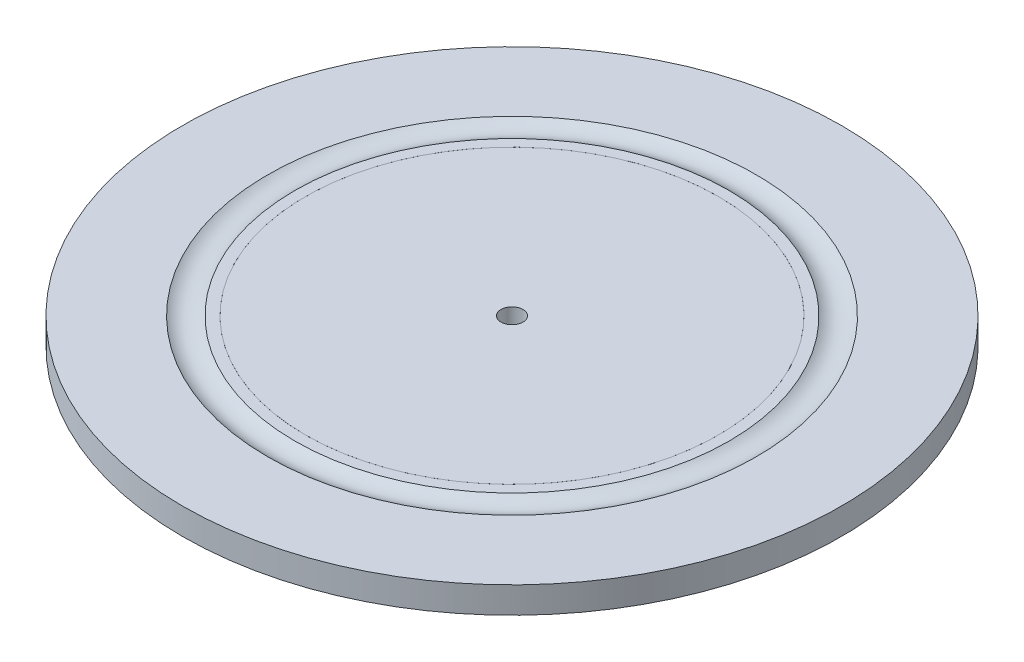
ISO-10303-21;
HEADER;
FILE_DESCRIPTION(('STEP AP214'),'2;1');
FILE_NAME('part.step','',(''),(''),'','','');
FILE_SCHEMA(('AUTOMOTIVE_DESIGN { 1 0 10303 214 1 1 1 1 }'));
ENDSEC;
DATA;
#1=APPLICATION_CONTEXT('core data for automotive mechanical design processes');
#2=APPLICATION_PROTOCOL_DEFINITION('international standard','automotive_design',2000,#1);
#3=PRODUCT_CONTEXT('',#1,'mechanical');
#4=PRODUCT('Part','Part','',(#3));
#5=PRODUCT_RELATED_PRODUCT_CATEGORY('part','',(#4));
#6=PRODUCT_DEFINITION_FORMATION('','',#4);
#7=PRODUCT_DEFINITION_CONTEXT('part definition',#1,'design');
#8=PRODUCT_DEFINITION('design','',#6,#7);
#9=PRODUCT_DEFINITION_SHAPE('','',#8);
#10=(LENGTH_UNIT() NAMED_UNIT(*) SI_UNIT(.MILLI.,.METRE.));
#11=(NAMED_UNIT(*) PLANE_ANGLE_UNIT() SI_UNIT($,.RADIAN.));
#12=(NAMED_UNIT(*) SI_UNIT($,.STERADIAN.) SOLID_ANGLE_UNIT());
#13=UNCERTAINTY_MEASURE_WITH_UNIT(LENGTH_MEASURE(1.E-05),#10,'distance_accuracy_value','');
#14=(GEOMETRIC_REPRESENTATION_CONTEXT(3) GLOBAL_UNCERTAINTY_ASSIGNED_CONTEXT((#13)) GLOBAL_UNIT_ASSIGNED_CONTEXT((#10,
#11,#12)) REPRESENTATION_CONTEXT('',''));
#15=CARTESIAN_POINT('',(0.,0.,0.));
#16=DIRECTION('',(0.,0.,1.));
#17=DIRECTION('',(1.,0.,0.));
#18=AXIS2_PLACEMENT_3D('',#15,#16,#17);
#19=CARTESIAN_POINT('',(59.,0.8724,0.));
#20=DIRECTION('',(0.,-1.,0.));
#21=DIRECTION('',(0.,0.,-1.));
#22=AXIS2_PLACEMENT_3D('',#19,#20,#21);
#23=PLANE('',#22);
#24=CARTESIAN_POINT('',(0.,0.8724,0.));
#25=DIRECTION('',(0.,1.,0.));
#26=DIRECTION('',(0.,0.,1.));
#27=AXIS2_PLACEMENT_3D('',#24,#25,#26);
#28=CIRCLE('',#27,47.);
#29=CARTESIAN_POINT('',(0.,0.8724,47.));
#30=VERTEX_POINT('',#29);
#31=EDGE_CURVE('E50',#30,#30,#28,.T.);
#32=ORIENTED_EDGE('',*,*,#31,.T.);
#33=EDGE_LOOP('',(#32));
#34=FACE_BOUND('',#33,.T.);
#35=CARTESIAN_POINT('',(0.,0.8724,0.));
#36=DIRECTION('',(0.,-1.,0.));
#37=DIRECTION('',(0.,0.,-1.));
#38=AXIS2_PLACEMENT_3D('',#35,#36,#37);
#39=CIRCLE('',#38,75.);
#40=CARTESIAN_POINT('',(0.,0.8724,-75.));
#41=VERTEX_POINT('',#40);
#42=EDGE_CURVE('E59',#41,#41,#39,.T.);
#43=ORIENTED_EDGE('',*,*,#42,.T.);
#44=EDGE_LOOP('',(#43));
#45=FACE_BOUND('',#44,.T.);
#46=ADVANCED_FACE('F39',(#34,#45),#23,.T.);
#47=CARTESIAN_POINT('',(0.,1.8724,0.));
#48=DIRECTION('',(0.,1.,0.));
#49=DIRECTION('',(0.,0.,1.));
#50=AXIS2_PLACEMENT_3D('',#47,#48,#49);
#51=TOROIDAL_SURFACE('',#50,47.,1.);
#52=CARTESIAN_POINT('',(0.,0.872424878980681,0.));
#53=DIRECTION('',(0.,1.,0.));
#54=DIRECTION('',(0.,0.,1.));
#55=AXIS2_PLACEMENT_3D('',#52,#53,#54);
#56=CIRCLE('',#55,46.9929461115406);
#57=CARTESIAN_POINT('',(0.,0.872424878980681,46.9929461115406));
#58=VERTEX_POINT('',#57);
#59=EDGE_CURVE('E11',#58,#58,#56,.F.);
#60=ORIENTED_EDGE('',*,*,#59,.F.);
#61=EDGE_LOOP('',(#60));
#62=FACE_BOUND('',#61,.T.);
#63=ORIENTED_EDGE('',*,*,#31,.F.);
#64=EDGE_LOOP('',(#63));
#65=FACE_BOUND('',#64,.T.);
#66=ADVANCED_FACE('F75',(#62,#65),#51,.T.);
#67=CARTESIAN_POINT('',(0.,5.8724,0.));
#68=DIRECTION('',(0.,1.,0.));
#69=DIRECTION('',(0.,0.,1.));
#70=AXIS2_PLACEMENT_3D('',#67,#68,#69);
#71=CONICAL_SURFACE('',#70,46.,0.785398163397353);
#72=CARTESIAN_POINT('',(0.,6.86534611154079,0.));
#73=DIRECTION('',(0.,1.,0.));
#74=DIRECTION('',(0.,0.,1.));
#75=AXIS2_PLACEMENT_3D('',#72,#73,#74);
#76=CIRCLE('',#75,46.9929461115406);
#77=CARTESIAN_POINT('',(0.,6.86534611154079,46.9929461115406));
#78=VERTEX_POINT('',#77);
#79=EDGE_CURVE('E42',#78,#78,#76,.T.);
#80=ORIENTED_EDGE('',*,*,#79,.F.);
#81=EDGE_LOOP('',(#80));
#82=FACE_BOUND('',#81,.T.);
#83=CARTESIAN_POINT('',(0.,6.87240000000019,0.));
#84=DIRECTION('',(0.,1.,0.));
#85=DIRECTION('',(0.,0.,1.));
#86=AXIS2_PLACEMENT_3D('',#83,#84,#85);
#87=CIRCLE('',#86,47.);
#88=CARTESIAN_POINT('',(0.,6.87240000000019,47.));
#89=VERTEX_POINT('',#88);
#90=EDGE_CURVE('E68',#89,#89,#87,.T.);
#91=ORIENTED_EDGE('',*,*,#90,.T.);
#92=EDGE_LOOP('',(#91));
#93=FACE_BOUND('',#92,.T.);
#94=ADVANCED_FACE('F77',(#82,#93),#71,.F.);
#95=CARTESIAN_POINT('',(47.,6.87240000000009,0.));
#96=DIRECTION('',(0.,1.,0.));
#97=DIRECTION('',(0.,0.,1.));
#98=AXIS2_PLACEMENT_3D('',#95,#96,#97);
#99=PLANE('',#98);
#100=CARTESIAN_POINT('',(0.,6.8724,0.));
#101=DIRECTION('',(0.,1.,0.));
#102=DIRECTION('',(0.,0.,1.));
#103=AXIS2_PLACEMENT_3D('',#100,#101,#102);
#104=CIRCLE('',#103,49.4043);
#105=CARTESIAN_POINT('',(0.,6.8724,49.4043));
#106=VERTEX_POINT('',#105);
#107=EDGE_CURVE('E65',#106,#106,#104,.T.);
#108=ORIENTED_EDGE('',*,*,#107,.T.);
#109=EDGE_LOOP('',(#108));
#110=FACE_BOUND('',#109,.T.);
#111=ORIENTED_EDGE('',*,*,#90,.F.);
#112=EDGE_LOOP('',(#111));
#113=FACE_BOUND('',#112,.T.);
#114=ADVANCED_FACE('F83',(#110,#113),#99,.T.);
#115=CARTESIAN_POINT('',(0.,11.,0.));
#116=DIRECTION('',(0.,1.,0.));
#117=DIRECTION('',(0.,0.,1.));
#118=AXIS2_PLACEMENT_3D('',#115,#116,#117);
#119=TOROIDAL_SURFACE('',#118,52.5,5.15950000000006);
#120=CARTESIAN_POINT('',(0.,6.87239999999989,0.));
#121=DIRECTION('',(0.,1.,0.));
#122=DIRECTION('',(0.,0.,1.));
#123=AXIS2_PLACEMENT_3D('',#120,#121,#122);
#124=CIRCLE('',#123,55.5957);
#125=CARTESIAN_POINT('',(0.,6.87239999999989,55.5957));
#126=VERTEX_POINT('',#125);
#127=EDGE_CURVE('E58',#126,#126,#124,.T.);
#128=ORIENTED_EDGE('',*,*,#127,.T.);
#129=EDGE_LOOP('',(#128));
#130=FACE_BOUND('',#129,.T.);
#131=ORIENTED_EDGE('',*,*,#107,.F.);
#132=EDGE_LOOP('',(#131));
#133=FACE_BOUND('',#132,.T.);
#134=ADVANCED_FACE('F89',(#130,#133),#119,.F.);
#135=CARTESIAN_POINT('',(55.5957,6.87239999999995,0.));
#136=DIRECTION('',(0.,1.,0.));
#137=DIRECTION('',(0.,0.,1.));
#138=AXIS2_PLACEMENT_3D('',#135,#136,#137);
#139=PLANE('',#138);
#140=ORIENTED_EDGE('',*,*,#127,.F.);
#141=EDGE_LOOP('',(#140));
#142=FACE_BOUND('',#141,.T.);
#143=CARTESIAN_POINT('',(0.,6.8724,0.));
#144=DIRECTION('',(0.,-1.,0.));
#145=DIRECTION('',(0.,0.,-1.));
#146=AXIS2_PLACEMENT_3D('',#143,#144,#145);
#147=CIRCLE('',#146,75.);
#148=CARTESIAN_POINT('',(0.,6.8724,-75.));
#149=VERTEX_POINT('',#148);
#150=EDGE_CURVE('E55',#149,#149,#147,.T.);
#151=ORIENTED_EDGE('',*,*,#150,.F.);
#152=EDGE_LOOP('',(#151));
#153=FACE_BOUND('',#152,.T.);
#154=ADVANCED_FACE('F93',(#142,#153),#139,.T.);
#155=CARTESIAN_POINT('',(0.,6.8724,0.));
#156=DIRECTION('',(0.,-1.,0.));
#157=DIRECTION('',(0.,0.,-1.));
#158=AXIS2_PLACEMENT_3D('',#155,#156,#157);
#159=CYLINDRICAL_SURFACE('',#158,75.);
#160=ORIENTED_EDGE('',*,*,#150,.T.);
#161=EDGE_LOOP('',(#160));
#162=FACE_BOUND('',#161,.T.);
#163=ORIENTED_EDGE('',*,*,#42,.F.);
#164=EDGE_LOOP('',(#163));
#165=FACE_BOUND('',#164,.T.);
#166=ADVANCED_FACE('F97',(#162,#165),#159,.T.);
#167=CARTESIAN_POINT('',(0.,6.8724,0.));
#168=DIRECTION('',(0.,-1.,0.));
#169=DIRECTION('',(0.,0.,-1.));
#170=AXIS2_PLACEMENT_3D('',#167,#168,#169);
#171=PLANE('',#170);
#172=CARTESIAN_POINT('',(0.,6.8724,0.));
#173=DIRECTION('',(0.,1.,0.));
#174=DIRECTION('',(0.,0.,1.));
#175=AXIS2_PLACEMENT_3D('',#172,#173,#174);
#176=CIRCLE('',#175,2.5);
#177=CARTESIAN_POINT('',(0.,6.8724,2.5));
#178=VERTEX_POINT('',#177);
#179=EDGE_CURVE('E126',#178,#178,#176,.T.);
#180=ORIENTED_EDGE('',*,*,#179,.F.);
#181=EDGE_LOOP('',(#180));
#182=FACE_BOUND('',#181,.T.);
#183=CARTESIAN_POINT('',(0.,6.8724,0.));
#184=DIRECTION('',(0.,-1.,0.));
#185=DIRECTION('',(0.,0.,-1.));
#186=AXIS2_PLACEMENT_3D('',#183,#184,#185);
#187=CIRCLE('',#186,46.9929461115406);
#188=CARTESIAN_POINT('',(0.,6.8724,-46.9929461115406));
#189=VERTEX_POINT('',#188);
#190=EDGE_CURVE('E62',#189,#189,#187,.T.);
#191=ORIENTED_EDGE('',*,*,#190,.F.);
#192=EDGE_LOOP('',(#191));
#193=FACE_BOUND('',#192,.T.);
#194=ADVANCED_FACE('F101',(#182,#193),#171,.F.);
#195=CARTESIAN_POINT('',(0.,6.8724,0.));
#196=DIRECTION('',(0.,-1.,0.));
#197=DIRECTION('',(0.,0.,-1.));
#198=AXIS2_PLACEMENT_3D('',#195,#196,#197);
#199=CYLINDRICAL_SURFACE('',#198,46.9929461115406);
#200=ORIENTED_EDGE('',*,*,#79,.T.);
#201=EDGE_LOOP('',(#200));
#202=FACE_BOUND('',#201,.T.);
#203=ORIENTED_EDGE('',*,*,#190,.T.);
#204=EDGE_LOOP('',(#203));
#205=FACE_BOUND('',#204,.T.);
#206=ADVANCED_FACE('F103',(#202,#205),#199,.T.);
#207=ORIENTED_EDGE('',*,*,#59,.T.);
#208=EDGE_LOOP('',(#207));
#209=FACE_BOUND('',#208,.T.);
#210=CARTESIAN_POINT('',(0.,0.8724,0.));
#211=DIRECTION('',(0.,-1.,0.));
#212=DIRECTION('',(0.,0.,-1.));
#213=AXIS2_PLACEMENT_3D('',#210,#211,#212);
#214=CIRCLE('',#213,46.9929461115406);
#215=CARTESIAN_POINT('',(0.,0.8724,-46.9929461115406));
#216=VERTEX_POINT('',#215);
#217=EDGE_CURVE('E53',#216,#216,#214,.T.);
#218=ORIENTED_EDGE('',*,*,#217,.F.);
#219=EDGE_LOOP('',(#218));
#220=FACE_BOUND('',#219,.T.);
#221=ADVANCED_FACE('F106',(#209,#220),#199,.T.);
#222=CARTESIAN_POINT('',(0.,0.8724,0.));
#223=DIRECTION('',(0.,-1.,0.));
#224=DIRECTION('',(0.,0.,-1.));
#225=AXIS2_PLACEMENT_3D('',#222,#223,#224);
#226=PLANE('',#225);
#227=CARTESIAN_POINT('',(0.,0.872400000000001,0.));
#228=DIRECTION('',(0.,1.,0.));
#229=DIRECTION('',(0.,0.,1.));
#230=AXIS2_PLACEMENT_3D('',#227,#228,#229);
#231=CIRCLE('',#230,2.5);
#232=CARTESIAN_POINT('',(0.,0.872400000000001,2.5));
#233=VERTEX_POINT('',#232);
#234=EDGE_CURVE('E123',#233,#233,#231,.T.);
#235=ORIENTED_EDGE('',*,*,#234,.T.);
#236=EDGE_LOOP('',(#235));
#237=FACE_BOUND('',#236,.T.);
#238=ORIENTED_EDGE('',*,*,#217,.T.);
#239=EDGE_LOOP('',(#238));
#240=FACE_BOUND('',#239,.T.);
#241=ADVANCED_FACE('F108',(#237,#240),#226,.T.);
#242=CARTESIAN_POINT('',(0.,0.872400000000001,0.));
#243=DIRECTION('',(0.,1.,0.));
#244=DIRECTION('',(0.,0.,1.));
#245=AXIS2_PLACEMENT_3D('',#242,#243,#244);
#246=CYLINDRICAL_SURFACE('',#245,2.5);
#247=ORIENTED_EDGE('',*,*,#234,.F.);
#248=EDGE_LOOP('',(#247));
#249=FACE_BOUND('',#248,.T.);
#250=ORIENTED_EDGE('',*,*,#179,.T.);
#251=EDGE_LOOP('',(#250));
#252=FACE_BOUND('',#251,.T.);
#253=ADVANCED_FACE('F111',(#249,#252),#246,.F.);
#254=CLOSED_SHELL('',(#46,#66,#94,#114,#134,#154,#166,#194,#206,#221,#241,#253));
#255=MANIFOLD_SOLID_BREP('B2',#254);
#256=ADVANCED_BREP_SHAPE_REPRESENTATION('',(#18,#255),#14);
#257=SHAPE_DEFINITION_REPRESENTATION(#9,#256);
ENDSEC;
END-ISO-10303-21;
